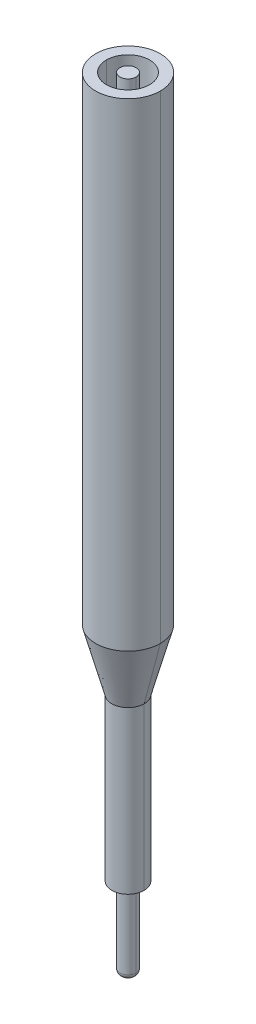
ISO-10303-21;
HEADER;
FILE_DESCRIPTION(('STEP AP214'),'2;1');
FILE_NAME('part.step','',(''),(''),'','','');
FILE_SCHEMA(('AUTOMOTIVE_DESIGN { 1 0 10303 214 1 1 1 1 }'));
ENDSEC;
DATA;
#1=APPLICATION_CONTEXT('core data for automotive mechanical design processes');
#2=APPLICATION_PROTOCOL_DEFINITION('international standard','automotive_design',2000,#1);
#3=PRODUCT_CONTEXT('',#1,'mechanical');
#4=PRODUCT('Part','Part','',(#3));
#5=PRODUCT_RELATED_PRODUCT_CATEGORY('part','',(#4));
#6=PRODUCT_DEFINITION_FORMATION('','',#4);
#7=PRODUCT_DEFINITION_CONTEXT('part definition',#1,'design');
#8=PRODUCT_DEFINITION('design','',#6,#7);
#9=PRODUCT_DEFINITION_SHAPE('','',#8);
#10=(LENGTH_UNIT() NAMED_UNIT(*) SI_UNIT(.MILLI.,.METRE.));
#11=(NAMED_UNIT(*) PLANE_ANGLE_UNIT() SI_UNIT($,.RADIAN.));
#12=(NAMED_UNIT(*) SI_UNIT($,.STERADIAN.) SOLID_ANGLE_UNIT());
#13=UNCERTAINTY_MEASURE_WITH_UNIT(LENGTH_MEASURE(1.E-05),#10,'distance_accuracy_value','');
#14=(GEOMETRIC_REPRESENTATION_CONTEXT(3) GLOBAL_UNCERTAINTY_ASSIGNED_CONTEXT((#13)) GLOBAL_UNIT_ASSIGNED_CONTEXT((#10,
#11,#12)) REPRESENTATION_CONTEXT('',''));
#15=CARTESIAN_POINT('',(0.,0.,0.));
#16=DIRECTION('',(0.,0.,1.));
#17=DIRECTION('',(1.,0.,0.));
#18=AXIS2_PLACEMENT_3D('',#15,#16,#17);
#19=CARTESIAN_POINT('',(0.,1.,0.));
#20=DIRECTION('',(0.,1.,0.));
#21=DIRECTION('',(-1.,0.,0.));
#22=AXIS2_PLACEMENT_3D('',#19,#20,#21);
#23=DEGENERATE_TOROIDAL_SURFACE('',#22,0.499999999999988,1.,.T.);
#24=CARTESIAN_POINT('',(0.5,1.,0.));
#25=DIRECTION('',(0.,0.,1.));
#26=DIRECTION('',(1.,0.,0.));
#27=AXIS2_PLACEMENT_3D('',#24,#25,#26);
#28=CIRCLE('',#27,1.);
#29=CARTESIAN_POINT('',(0.5,0.,0.));
#30=VERTEX_POINT('',#29);
#31=CARTESIAN_POINT('',(1.5,1.,0.));
#32=VERTEX_POINT('',#31);
#33=EDGE_CURVE('E235',#30,#32,#28,.T.);
#34=ORIENTED_EDGE('',*,*,#33,.F.);
#35=CARTESIAN_POINT('',(0.,0.,0.));
#36=DIRECTION('',(0.,-1.,0.));
#37=DIRECTION('',(-1.,0.,0.));
#38=AXIS2_PLACEMENT_3D('',#35,#36,#37);
#39=CIRCLE('',#38,0.499999999999988);
#40=CARTESIAN_POINT('',(-0.499999999999976,0.,0.));
#41=VERTEX_POINT('',#40);
#42=EDGE_CURVE('E11',#41,#30,#39,.T.);
#43=ORIENTED_EDGE('',*,*,#42,.F.);
#44=CARTESIAN_POINT('',(-0.499999999999976,1.,0.));
#45=DIRECTION('',(0.,0.,-1.));
#46=DIRECTION('',(-1.,0.,0.));
#47=AXIS2_PLACEMENT_3D('',#44,#45,#46);
#48=CIRCLE('',#47,1.);
#49=CARTESIAN_POINT('',(-1.49999999999998,1.,0.));
#50=VERTEX_POINT('',#49);
#51=EDGE_CURVE('E234',#41,#50,#48,.T.);
#52=ORIENTED_EDGE('',*,*,#51,.T.);
#53=CARTESIAN_POINT('',(0.,1.,0.));
#54=DIRECTION('',(0.,1.,0.));
#55=DIRECTION('',(-1.,0.,0.));
#56=AXIS2_PLACEMENT_3D('',#53,#54,#55);
#57=CIRCLE('',#56,1.49999999999999);
#58=EDGE_CURVE('E29',#32,#50,#57,.T.);
#59=ORIENTED_EDGE('',*,*,#58,.F.);
#60=EDGE_LOOP('',(#34,#43,#52,#59));
#61=FACE_BOUND('',#60,.T.);
#62=ADVANCED_FACE('F19',(#61),#23,.T.);
#63=CARTESIAN_POINT('',(0.,0.,0.));
#64=DIRECTION('',(0.,1.,0.));
#65=DIRECTION('',(1.,0.,0.));
#66=AXIS2_PLACEMENT_3D('',#63,#64,#65);
#67=PLANE('',#66);
#68=ORIENTED_EDGE('',*,*,#42,.T.);
#69=CARTESIAN_POINT('',(0.,0.,0.));
#70=DIRECTION('',(0.,-1.,0.));
#71=DIRECTION('',(-1.,0.,0.));
#72=AXIS2_PLACEMENT_3D('',#69,#70,#71);
#73=CIRCLE('',#72,0.499999999999988);
#74=EDGE_CURVE('E256',#30,#41,#73,.T.);
#75=ORIENTED_EDGE('',*,*,#74,.T.);
#76=EDGE_LOOP('',(#68,#75));
#77=FACE_BOUND('',#76,.T.);
#78=ADVANCED_FACE('F308',(#77),#67,.F.);
#79=CARTESIAN_POINT('',(0.,145.,0.));
#80=DIRECTION('',(0.,1.,0.));
#81=DIRECTION('',(-1.,0.,0.));
#82=AXIS2_PLACEMENT_3D('',#79,#80,#81);
#83=CYLINDRICAL_SURFACE('',#82,1.49999999999999);
#84=DIRECTION('',(0.,1.,0.));
#85=VECTOR('',#84,1.);
#86=CARTESIAN_POINT('',(1.49999999999999,145.,0.));
#87=LINE('',#86,#85);
#88=CARTESIAN_POINT('',(1.5,15.,0.));
#89=VERTEX_POINT('',#88);
#90=EDGE_CURVE('E197',#32,#89,#87,.T.);
#91=ORIENTED_EDGE('',*,*,#90,.F.);
#92=ORIENTED_EDGE('',*,*,#58,.T.);
#93=DIRECTION('',(0.,1.,0.));
#94=VECTOR('',#93,1.);
#95=CARTESIAN_POINT('',(-1.5,145.,0.));
#96=LINE('',#95,#94);
#97=CARTESIAN_POINT('',(-1.49999999999998,15.,0.));
#98=VERTEX_POINT('',#97);
#99=EDGE_CURVE('E196',#50,#98,#96,.T.);
#100=ORIENTED_EDGE('',*,*,#99,.T.);
#101=CARTESIAN_POINT('',(0.,15.,0.));
#102=DIRECTION('',(0.,1.,0.));
#103=DIRECTION('',(-1.,0.,0.));
#104=AXIS2_PLACEMENT_3D('',#101,#102,#103);
#105=CIRCLE('',#104,1.5);
#106=EDGE_CURVE('E184',#89,#98,#105,.T.);
#107=ORIENTED_EDGE('',*,*,#106,.F.);
#108=EDGE_LOOP('',(#91,#92,#100,#107));
#109=FACE_BOUND('',#108,.T.);
#110=ADVANCED_FACE('F314',(#109),#83,.T.);
#111=CARTESIAN_POINT('',(1.5,15.,0.));
#112=DIRECTION('',(0.,1.,0.));
#113=DIRECTION('',(1.,0.,0.));
#114=AXIS2_PLACEMENT_3D('',#111,#112,#113);
#115=PLANE('',#114);
#116=CARTESIAN_POINT('',(0.,15.,0.));
#117=DIRECTION('',(0.,1.,0.));
#118=DIRECTION('',(-1.,0.,0.));
#119=AXIS2_PLACEMENT_3D('',#116,#117,#118);
#120=CIRCLE('',#119,1.5);
#121=EDGE_CURVE('E192',#98,#89,#120,.T.);
#122=ORIENTED_EDGE('',*,*,#121,.T.);
#123=ORIENTED_EDGE('',*,*,#106,.T.);
#124=EDGE_LOOP('',(#122,#123));
#125=FACE_BOUND('',#124,.T.);
#126=CARTESIAN_POINT('',(0.,15.,0.));
#127=DIRECTION('',(0.,1.,0.));
#128=DIRECTION('',(-1.,0.,0.));
#129=AXIS2_PLACEMENT_3D('',#126,#127,#128);
#130=CIRCLE('',#129,3.);
#131=CARTESIAN_POINT('',(-3.,15.,0.));
#132=VERTEX_POINT('',#131);
#133=CARTESIAN_POINT('',(3.,15.,0.));
#134=VERTEX_POINT('',#133);
#135=EDGE_CURVE('E225',#132,#134,#130,.T.);
#136=ORIENTED_EDGE('',*,*,#135,.F.);
#137=CARTESIAN_POINT('',(0.,15.,0.));
#138=DIRECTION('',(0.,1.,0.));
#139=DIRECTION('',(-1.,0.,0.));
#140=AXIS2_PLACEMENT_3D('',#137,#138,#139);
#141=CIRCLE('',#140,3.);
#142=EDGE_CURVE('E82',#134,#132,#141,.T.);
#143=ORIENTED_EDGE('',*,*,#142,.F.);
#144=EDGE_LOOP('',(#136,#143));
#145=FACE_BOUND('',#144,.T.);
#146=ADVANCED_FACE('F325',(#125,#145),#115,.F.);
#147=CARTESIAN_POINT('',(0.,145.,0.));
#148=DIRECTION('',(0.,1.,0.));
#149=DIRECTION('',(-1.,0.,0.));
#150=AXIS2_PLACEMENT_3D('',#147,#148,#149);
#151=CYLINDRICAL_SURFACE('',#150,3.);
#152=DIRECTION('',(0.,1.,0.));
#153=VECTOR('',#152,1.);
#154=CARTESIAN_POINT('',(3.,145.,0.));
#155=LINE('',#154,#153);
#156=CARTESIAN_POINT('',(3.,45.,0.));
#157=VERTEX_POINT('',#156);
#158=EDGE_CURVE('E229',#134,#157,#155,.T.);
#159=ORIENTED_EDGE('',*,*,#158,.F.);
#160=ORIENTED_EDGE('',*,*,#142,.T.);
#161=DIRECTION('',(0.,1.,0.));
#162=VECTOR('',#161,1.);
#163=CARTESIAN_POINT('',(-3.,145.,0.));
#164=LINE('',#163,#162);
#165=CARTESIAN_POINT('',(-3.,45.,0.));
#166=VERTEX_POINT('',#165);
#167=EDGE_CURVE('E216',#132,#166,#164,.T.);
#168=ORIENTED_EDGE('',*,*,#167,.T.);
#169=CARTESIAN_POINT('',(0.,45.,0.));
#170=DIRECTION('',(0.,1.,0.));
#171=DIRECTION('',(-1.,0.,0.));
#172=AXIS2_PLACEMENT_3D('',#169,#170,#171);
#173=CIRCLE('',#172,3.);
#174=EDGE_CURVE('E69',#157,#166,#173,.T.);
#175=ORIENTED_EDGE('',*,*,#174,.F.);
#176=EDGE_LOOP('',(#159,#160,#168,#175));
#177=FACE_BOUND('',#176,.T.);
#178=ADVANCED_FACE('F322',(#177),#151,.T.);
#179=CARTESIAN_POINT('',(0.,45.,0.));
#180=DIRECTION('',(0.,1.,0.));
#181=DIRECTION('',(-1.,0.,0.));
#182=AXIS2_PLACEMENT_3D('',#179,#180,#181);
#183=CONICAL_SURFACE('',#182,3.,0.26179938779915);
#184=DIRECTION('',(0.258819045102522,0.965925826289068,0.));
#185=VECTOR('',#184,1.);
#186=CARTESIAN_POINT('',(3.,45.,0.));
#187=LINE('',#186,#185);
#188=CARTESIAN_POINT('',(6.,56.1961524227066,0.));
#189=VERTEX_POINT('',#188);
#190=EDGE_CURVE('E212',#157,#189,#187,.T.);
#191=ORIENTED_EDGE('',*,*,#190,.F.);
#192=ORIENTED_EDGE('',*,*,#174,.T.);
#193=DIRECTION('',(-0.258819045102522,0.965925826289068,0.));
#194=VECTOR('',#193,1.);
#195=CARTESIAN_POINT('',(-3.,45.,0.));
#196=LINE('',#195,#194);
#197=CARTESIAN_POINT('',(-6.,56.1961524227066,0.));
#198=VERTEX_POINT('',#197);
#199=EDGE_CURVE('E183',#166,#198,#196,.T.);
#200=ORIENTED_EDGE('',*,*,#199,.T.);
#201=CARTESIAN_POINT('',(0.,56.1961524227066,0.));
#202=DIRECTION('',(0.,1.,0.));
#203=DIRECTION('',(-1.,0.,0.));
#204=AXIS2_PLACEMENT_3D('',#201,#202,#203);
#205=CIRCLE('',#204,6.);
#206=EDGE_CURVE('E200',#189,#198,#205,.T.);
#207=ORIENTED_EDGE('',*,*,#206,.F.);
#208=EDGE_LOOP('',(#191,#192,#200,#207));
#209=FACE_BOUND('',#208,.T.);
#210=ADVANCED_FACE('F324',(#209),#183,.T.);
#211=CARTESIAN_POINT('',(0.,145.,0.));
#212=DIRECTION('',(0.,1.,0.));
#213=DIRECTION('',(-1.,0.,0.));
#214=AXIS2_PLACEMENT_3D('',#211,#212,#213);
#215=CYLINDRICAL_SURFACE('',#214,6.);
#216=DIRECTION('',(0.,1.,0.));
#217=VECTOR('',#216,1.);
#218=CARTESIAN_POINT('',(6.,145.,0.));
#219=LINE('',#218,#217);
#220=CARTESIAN_POINT('',(6.,145.,0.));
#221=VERTEX_POINT('',#220);
#222=EDGE_CURVE('E178',#189,#221,#219,.T.);
#223=ORIENTED_EDGE('',*,*,#222,.F.);
#224=ORIENTED_EDGE('',*,*,#206,.T.);
#225=DIRECTION('',(0.,1.,0.));
#226=VECTOR('',#225,1.);
#227=CARTESIAN_POINT('',(-6.,145.,0.));
#228=LINE('',#227,#226);
#229=CARTESIAN_POINT('',(-6.,145.,0.));
#230=VERTEX_POINT('',#229);
#231=EDGE_CURVE('E224',#198,#230,#228,.T.);
#232=ORIENTED_EDGE('',*,*,#231,.T.);
#233=CARTESIAN_POINT('',(0.,145.,0.));
#234=DIRECTION('',(0.,1.,0.));
#235=DIRECTION('',(-1.,0.,0.));
#236=AXIS2_PLACEMENT_3D('',#233,#234,#235);
#237=CIRCLE('',#236,6.);
#238=EDGE_CURVE('E198',#221,#230,#237,.T.);
#239=ORIENTED_EDGE('',*,*,#238,.F.);
#240=EDGE_LOOP('',(#223,#224,#232,#239));
#241=FACE_BOUND('',#240,.T.);
#242=ADVANCED_FACE('F303',(#241),#215,.T.);
#243=CARTESIAN_POINT('',(4.,145.,0.));
#244=DIRECTION('',(0.,-1.,0.));
#245=DIRECTION('',(0.,0.,-1.));
#246=AXIS2_PLACEMENT_3D('',#243,#244,#245);
#247=PLANE('',#246);
#248=CARTESIAN_POINT('',(0.,145.,0.));
#249=DIRECTION('',(0.,1.,0.));
#250=DIRECTION('',(-1.,0.,0.));
#251=AXIS2_PLACEMENT_3D('',#248,#249,#250);
#252=CIRCLE('',#251,4.);
#253=CARTESIAN_POINT('',(-4.,145.,0.));
#254=VERTEX_POINT('',#253);
#255=CARTESIAN_POINT('',(4.,145.,0.));
#256=VERTEX_POINT('',#255);
#257=EDGE_CURVE('E189',#254,#256,#252,.T.);
#258=ORIENTED_EDGE('',*,*,#257,.F.);
#259=CARTESIAN_POINT('',(0.,145.,0.));
#260=DIRECTION('',(0.,1.,0.));
#261=DIRECTION('',(-1.,0.,0.));
#262=AXIS2_PLACEMENT_3D('',#259,#260,#261);
#263=CIRCLE('',#262,4.);
#264=EDGE_CURVE('E175',#256,#254,#263,.T.);
#265=ORIENTED_EDGE('',*,*,#264,.F.);
#266=EDGE_LOOP('',(#258,#265));
#267=FACE_BOUND('',#266,.T.);
#268=CARTESIAN_POINT('',(0.,145.,0.));
#269=DIRECTION('',(0.,1.,0.));
#270=DIRECTION('',(-1.,0.,0.));
#271=AXIS2_PLACEMENT_3D('',#268,#269,#270);
#272=CIRCLE('',#271,6.);
#273=EDGE_CURVE('E182',#230,#221,#272,.T.);
#274=ORIENTED_EDGE('',*,*,#273,.T.);
#275=ORIENTED_EDGE('',*,*,#238,.T.);
#276=EDGE_LOOP('',(#274,#275));
#277=FACE_BOUND('',#276,.T.);
#278=ADVANCED_FACE('F291',(#267,#277),#247,.F.);
#279=CARTESIAN_POINT('',(0.,145.,0.));
#280=DIRECTION('',(0.,1.,0.));
#281=DIRECTION('',(-1.,0.,0.));
#282=AXIS2_PLACEMENT_3D('',#279,#280,#281);
#283=CYLINDRICAL_SURFACE('',#282,4.);
#284=DIRECTION('',(0.,1.,0.));
#285=VECTOR('',#284,1.);
#286=CARTESIAN_POINT('',(4.,145.,0.));
#287=LINE('',#286,#285);
#288=CARTESIAN_POINT('',(4.,122.5,0.));
#289=VERTEX_POINT('',#288);
#290=EDGE_CURVE('E223',#289,#256,#287,.T.);
#291=ORIENTED_EDGE('',*,*,#290,.F.);
#292=CARTESIAN_POINT('',(0.,122.5,0.));
#293=DIRECTION('',(0.,1.,0.));
#294=DIRECTION('',(-1.,0.,0.));
#295=AXIS2_PLACEMENT_3D('',#292,#293,#294);
#296=CIRCLE('',#295,4.);
#297=CARTESIAN_POINT('',(-4.,122.5,0.));
#298=VERTEX_POINT('',#297);
#299=EDGE_CURVE('E161',#298,#289,#296,.T.);
#300=ORIENTED_EDGE('',*,*,#299,.F.);
#301=DIRECTION('',(0.,1.,0.));
#302=VECTOR('',#301,1.);
#303=CARTESIAN_POINT('',(-4.,145.,0.));
#304=LINE('',#303,#302);
#305=EDGE_CURVE('E169',#298,#254,#304,.T.);
#306=ORIENTED_EDGE('',*,*,#305,.T.);
#307=ORIENTED_EDGE('',*,*,#257,.T.);
#308=EDGE_LOOP('',(#291,#300,#306,#307));
#309=FACE_BOUND('',#308,.T.);
#310=ADVANCED_FACE('F294',(#309),#283,.F.);
#311=CARTESIAN_POINT('',(0.,122.5,0.));
#312=DIRECTION('',(0.,1.,0.));
#313=DIRECTION('',(-1.,0.,0.));
#314=AXIS2_PLACEMENT_3D('',#311,#312,#313);
#315=CONICAL_SURFACE('',#314,4.,0.785398163397421);
#316=DIRECTION('',(0.707106781186528,0.707106781186567,0.));
#317=VECTOR('',#316,1.);
#318=CARTESIAN_POINT('',(4.,122.5,0.));
#319=LINE('',#318,#317);
#320=CARTESIAN_POINT('',(1.5,120.,0.));
#321=VERTEX_POINT('',#320);
#322=EDGE_CURVE('E159',#321,#289,#319,.T.);
#323=ORIENTED_EDGE('',*,*,#322,.F.);
#324=CARTESIAN_POINT('',(0.,120.,0.));
#325=DIRECTION('',(0.,1.,0.));
#326=DIRECTION('',(-1.,0.,0.));
#327=AXIS2_PLACEMENT_3D('',#324,#325,#326);
#328=CIRCLE('',#327,1.5);
#329=CARTESIAN_POINT('',(-1.5,120.,0.));
#330=VERTEX_POINT('',#329);
#331=EDGE_CURVE('E147',#330,#321,#328,.T.);
#332=ORIENTED_EDGE('',*,*,#331,.F.);
#333=DIRECTION('',(-0.707106781186528,0.707106781186567,0.));
#334=VECTOR('',#333,1.);
#335=CARTESIAN_POINT('',(-4.,122.5,0.));
#336=LINE('',#335,#334);
#337=EDGE_CURVE('E156',#330,#298,#336,.T.);
#338=ORIENTED_EDGE('',*,*,#337,.T.);
#339=ORIENTED_EDGE('',*,*,#299,.T.);
#340=EDGE_LOOP('',(#323,#332,#338,#339));
#341=FACE_BOUND('',#340,.T.);
#342=ADVANCED_FACE('F160',(#341),#315,.F.);
#343=CARTESIAN_POINT('',(0.,145.,0.));
#344=DIRECTION('',(0.,1.,0.));
#345=DIRECTION('',(-1.,0.,0.));
#346=AXIS2_PLACEMENT_3D('',#343,#344,#345);
#347=CYLINDRICAL_SURFACE('',#346,1.5);
#348=DIRECTION('',(0.,1.,0.));
#349=VECTOR('',#348,1.);
#350=CARTESIAN_POINT('',(1.5,145.,0.));
#351=LINE('',#350,#349);
#352=CARTESIAN_POINT('',(1.5,145.,0.));
#353=VERTEX_POINT('',#352);
#354=EDGE_CURVE('E23',#321,#353,#351,.T.);
#355=ORIENTED_EDGE('',*,*,#354,.F.);
#356=CARTESIAN_POINT('',(0.,120.,0.));
#357=DIRECTION('',(0.,1.,0.));
#358=DIRECTION('',(-1.,0.,0.));
#359=AXIS2_PLACEMENT_3D('',#356,#357,#358);
#360=CIRCLE('',#359,1.5);
#361=EDGE_CURVE('E142',#321,#330,#360,.T.);
#362=ORIENTED_EDGE('',*,*,#361,.T.);
#363=DIRECTION('',(0.,1.,0.));
#364=VECTOR('',#363,1.);
#365=CARTESIAN_POINT('',(-1.5,145.,0.));
#366=LINE('',#365,#364);
#367=CARTESIAN_POINT('',(-1.5,145.,0.));
#368=VERTEX_POINT('',#367);
#369=EDGE_CURVE('E151',#330,#368,#366,.T.);
#370=ORIENTED_EDGE('',*,*,#369,.T.);
#371=CARTESIAN_POINT('',(0.,145.,0.));
#372=DIRECTION('',(0.,1.,0.));
#373=DIRECTION('',(-1.,0.,0.));
#374=AXIS2_PLACEMENT_3D('',#371,#372,#373);
#375=CIRCLE('',#374,1.5);
#376=EDGE_CURVE('E42',#353,#368,#375,.T.);
#377=ORIENTED_EDGE('',*,*,#376,.F.);
#378=EDGE_LOOP('',(#355,#362,#370,#377));
#379=FACE_BOUND('',#378,.T.);
#380=ADVANCED_FACE('F140',(#379),#347,.T.);
#381=CARTESIAN_POINT('',(0.,145.,0.));
#382=DIRECTION('',(0.,-1.,0.));
#383=DIRECTION('',(0.,0.,-1.));
#384=AXIS2_PLACEMENT_3D('',#381,#382,#383);
#385=PLANE('',#384);
#386=CARTESIAN_POINT('',(0.,145.,0.));
#387=DIRECTION('',(0.,1.,0.));
#388=DIRECTION('',(-1.,0.,0.));
#389=AXIS2_PLACEMENT_3D('',#386,#387,#388);
#390=CIRCLE('',#389,1.5);
#391=EDGE_CURVE('E146',#368,#353,#390,.T.);
#392=ORIENTED_EDGE('',*,*,#391,.T.);
#393=ORIENTED_EDGE('',*,*,#376,.T.);
#394=EDGE_LOOP('',(#392,#393));
#395=FACE_BOUND('',#394,.T.);
#396=ADVANCED_FACE('F329',(#395),#385,.F.);
#397=CARTESIAN_POINT('',(0.,145.,0.));
#398=DIRECTION('',(0.,1.,0.));
#399=DIRECTION('',(-1.,0.,0.));
#400=AXIS2_PLACEMENT_3D('',#397,#398,#399);
#401=CYLINDRICAL_SURFACE('',#400,1.5);
#402=ORIENTED_EDGE('',*,*,#331,.T.);
#403=ORIENTED_EDGE('',*,*,#354,.T.);
#404=ORIENTED_EDGE('',*,*,#391,.F.);
#405=ORIENTED_EDGE('',*,*,#369,.F.);
#406=EDGE_LOOP('',(#402,#403,#404,#405));
#407=FACE_BOUND('',#406,.T.);
#408=ADVANCED_FACE('F150',(#407),#401,.T.);
#409=CARTESIAN_POINT('',(0.,122.5,0.));
#410=DIRECTION('',(0.,1.,0.));
#411=DIRECTION('',(-1.,0.,0.));
#412=AXIS2_PLACEMENT_3D('',#409,#410,#411);
#413=CONICAL_SURFACE('',#412,4.,0.785398163397421);
#414=ORIENTED_EDGE('',*,*,#361,.F.);
#415=ORIENTED_EDGE('',*,*,#322,.T.);
#416=CARTESIAN_POINT('',(0.,122.5,0.));
#417=DIRECTION('',(0.,1.,0.));
#418=DIRECTION('',(-1.,0.,0.));
#419=AXIS2_PLACEMENT_3D('',#416,#417,#418);
#420=CIRCLE('',#419,4.);
#421=EDGE_CURVE('E220',#289,#298,#420,.T.);
#422=ORIENTED_EDGE('',*,*,#421,.T.);
#423=ORIENTED_EDGE('',*,*,#337,.F.);
#424=EDGE_LOOP('',(#414,#415,#422,#423));
#425=FACE_BOUND('',#424,.T.);
#426=ADVANCED_FACE('F167',(#425),#413,.F.);
#427=CARTESIAN_POINT('',(0.,145.,0.));
#428=DIRECTION('',(0.,1.,0.));
#429=DIRECTION('',(-1.,0.,0.));
#430=AXIS2_PLACEMENT_3D('',#427,#428,#429);
#431=CYLINDRICAL_SURFACE('',#430,4.);
#432=ORIENTED_EDGE('',*,*,#421,.F.);
#433=ORIENTED_EDGE('',*,*,#290,.T.);
#434=ORIENTED_EDGE('',*,*,#264,.T.);
#435=ORIENTED_EDGE('',*,*,#305,.F.);
#436=EDGE_LOOP('',(#432,#433,#434,#435));
#437=FACE_BOUND('',#436,.T.);
#438=ADVANCED_FACE('F289',(#437),#431,.F.);
#439=CARTESIAN_POINT('',(0.,145.,0.));
#440=DIRECTION('',(0.,1.,0.));
#441=DIRECTION('',(-1.,0.,0.));
#442=AXIS2_PLACEMENT_3D('',#439,#440,#441);
#443=CYLINDRICAL_SURFACE('',#442,6.);
#444=CARTESIAN_POINT('',(0.,56.1961524227066,0.));
#445=DIRECTION('',(0.,1.,0.));
#446=DIRECTION('',(-1.,0.,0.));
#447=AXIS2_PLACEMENT_3D('',#444,#445,#446);
#448=CIRCLE('',#447,6.);
#449=EDGE_CURVE('E204',#198,#189,#448,.T.);
#450=ORIENTED_EDGE('',*,*,#449,.T.);
#451=ORIENTED_EDGE('',*,*,#222,.T.);
#452=ORIENTED_EDGE('',*,*,#273,.F.);
#453=ORIENTED_EDGE('',*,*,#231,.F.);
#454=EDGE_LOOP('',(#450,#451,#452,#453));
#455=FACE_BOUND('',#454,.T.);
#456=ADVANCED_FACE('F339',(#455),#443,.T.);
#457=CARTESIAN_POINT('',(0.,45.,0.));
#458=DIRECTION('',(0.,1.,0.));
#459=DIRECTION('',(-1.,0.,0.));
#460=AXIS2_PLACEMENT_3D('',#457,#458,#459);
#461=CONICAL_SURFACE('',#460,3.,0.26179938779915);
#462=CARTESIAN_POINT('',(0.,45.,0.));
#463=DIRECTION('',(0.,1.,0.));
#464=DIRECTION('',(-1.,0.,0.));
#465=AXIS2_PLACEMENT_3D('',#462,#463,#464);
#466=CIRCLE('',#465,3.);
#467=EDGE_CURVE('E252',#166,#157,#466,.T.);
#468=ORIENTED_EDGE('',*,*,#467,.T.);
#469=ORIENTED_EDGE('',*,*,#190,.T.);
#470=ORIENTED_EDGE('',*,*,#449,.F.);
#471=ORIENTED_EDGE('',*,*,#199,.F.);
#472=EDGE_LOOP('',(#468,#469,#470,#471));
#473=FACE_BOUND('',#472,.T.);
#474=ADVANCED_FACE('F320',(#473),#461,.T.);
#475=CARTESIAN_POINT('',(0.,145.,0.));
#476=DIRECTION('',(0.,1.,0.));
#477=DIRECTION('',(-1.,0.,0.));
#478=AXIS2_PLACEMENT_3D('',#475,#476,#477);
#479=CYLINDRICAL_SURFACE('',#478,3.);
#480=ORIENTED_EDGE('',*,*,#135,.T.);
#481=ORIENTED_EDGE('',*,*,#158,.T.);
#482=ORIENTED_EDGE('',*,*,#467,.F.);
#483=ORIENTED_EDGE('',*,*,#167,.F.);
#484=EDGE_LOOP('',(#480,#481,#482,#483));
#485=FACE_BOUND('',#484,.T.);
#486=ADVANCED_FACE('F21',(#485),#479,.T.);
#487=CARTESIAN_POINT('',(0.,145.,0.));
#488=DIRECTION('',(0.,1.,0.));
#489=DIRECTION('',(-1.,0.,0.));
#490=AXIS2_PLACEMENT_3D('',#487,#488,#489);
#491=CYLINDRICAL_SURFACE('',#490,1.49999999999999);
#492=CARTESIAN_POINT('',(0.,1.,0.));
#493=DIRECTION('',(0.,1.,0.));
#494=DIRECTION('',(-1.,0.,0.));
#495=AXIS2_PLACEMENT_3D('',#492,#493,#494);
#496=CIRCLE('',#495,1.49999999999999);
#497=EDGE_CURVE('E230',#50,#32,#496,.T.);
#498=ORIENTED_EDGE('',*,*,#497,.T.);
#499=ORIENTED_EDGE('',*,*,#90,.T.);
#500=ORIENTED_EDGE('',*,*,#121,.F.);
#501=ORIENTED_EDGE('',*,*,#99,.F.);
#502=EDGE_LOOP('',(#498,#499,#500,#501));
#503=FACE_BOUND('',#502,.T.);
#504=ADVANCED_FACE('F333',(#503),#491,.T.);
#505=CARTESIAN_POINT('',(0.,1.,0.));
#506=DIRECTION('',(0.,1.,0.));
#507=DIRECTION('',(-1.,0.,0.));
#508=AXIS2_PLACEMENT_3D('',#505,#506,#507);
#509=DEGENERATE_TOROIDAL_SURFACE('',#508,0.499999999999988,1.,.T.);
#510=ORIENTED_EDGE('',*,*,#74,.F.);
#511=ORIENTED_EDGE('',*,*,#33,.T.);
#512=ORIENTED_EDGE('',*,*,#497,.F.);
#513=ORIENTED_EDGE('',*,*,#51,.F.);
#514=EDGE_LOOP('',(#510,#511,#512,#513));
#515=FACE_BOUND('',#514,.T.);
#516=ADVANCED_FACE('F330',(#515),#509,.T.);
#517=CLOSED_SHELL('',(#62,#78,#110,#146,#178,#210,#242,#278,#310,#342,#380,#396,#408,#426,#438,
#456,#474,#486,#504,#516));
#518=MANIFOLD_SOLID_BREP('B1',#517);
#519=ADVANCED_BREP_SHAPE_REPRESENTATION('',(#18,#518),#14);
#520=SHAPE_DEFINITION_REPRESENTATION(#9,#519);
ENDSEC;
END-ISO-10303-21;
